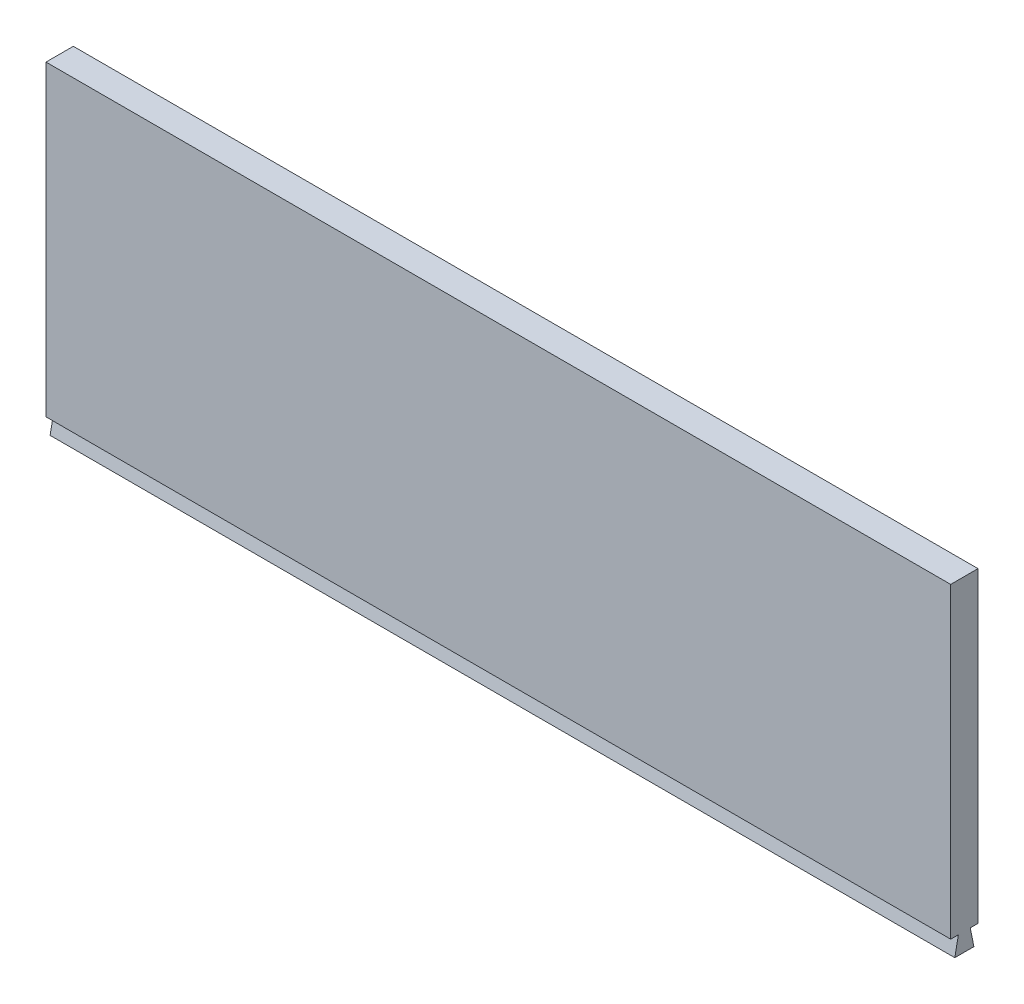
ISO-10303-21;
HEADER;
FILE_DESCRIPTION(('STEP AP214'),'2;1');
FILE_NAME('part.step','',(''),(''),'','','');
FILE_SCHEMA(('AUTOMOTIVE_DESIGN { 1 0 10303 214 1 1 1 1 }'));
ENDSEC;
DATA;
#1=APPLICATION_CONTEXT('core data for automotive mechanical design processes');
#2=APPLICATION_PROTOCOL_DEFINITION('international standard','automotive_design',2000,#1);
#3=PRODUCT_CONTEXT('',#1,'mechanical');
#4=PRODUCT('Part','Part','',(#3));
#5=PRODUCT_RELATED_PRODUCT_CATEGORY('part','',(#4));
#6=PRODUCT_DEFINITION_FORMATION('','',#4);
#7=PRODUCT_DEFINITION_CONTEXT('part definition',#1,'design');
#8=PRODUCT_DEFINITION('design','',#6,#7);
#9=PRODUCT_DEFINITION_SHAPE('','',#8);
#10=(LENGTH_UNIT() NAMED_UNIT(*) SI_UNIT(.MILLI.,.METRE.));
#11=(NAMED_UNIT(*) PLANE_ANGLE_UNIT() SI_UNIT($,.RADIAN.));
#12=(NAMED_UNIT(*) SI_UNIT($,.STERADIAN.) SOLID_ANGLE_UNIT());
#13=UNCERTAINTY_MEASURE_WITH_UNIT(LENGTH_MEASURE(1.E-05),#10,'distance_accuracy_value','');
#14=(GEOMETRIC_REPRESENTATION_CONTEXT(3) GLOBAL_UNCERTAINTY_ASSIGNED_CONTEXT((#13)) GLOBAL_UNIT_ASSIGNED_CONTEXT((#10,
#11,#12)) REPRESENTATION_CONTEXT('',''));
#15=CARTESIAN_POINT('',(0.,0.,0.));
#16=DIRECTION('',(0.,0.,1.));
#17=DIRECTION('',(1.,0.,0.));
#18=AXIS2_PLACEMENT_3D('',#15,#16,#17);
#19=CARTESIAN_POINT('',(0.,0.,8.));
#20=DIRECTION('',(0.,1.,0.));
#21=DIRECTION('',(0.,0.,1.));
#22=AXIS2_PLACEMENT_3D('',#19,#20,#21);
#23=PLANE('',#22);
#24=DIRECTION('',(-1.,0.,0.));
#25=VECTOR('',#24,1.);
#26=CARTESIAN_POINT('',(265.,0.,5.74));
#27=LINE('',#26,#25);
#28=CARTESIAN_POINT('',(265.,0.,5.74));
#29=VERTEX_POINT('',#28);
#30=CARTESIAN_POINT('',(0.,0.,5.74));
#31=VERTEX_POINT('',#30);
#32=EDGE_CURVE('E145',#29,#31,#27,.T.);
#33=ORIENTED_EDGE('',*,*,#32,.F.);
#34=DIRECTION('',(0.,0.,-1.));
#35=VECTOR('',#34,1.);
#36=CARTESIAN_POINT('',(265.,0.,8.));
#37=LINE('',#36,#35);
#38=CARTESIAN_POINT('',(265.,0.,8.));
#39=VERTEX_POINT('',#38);
#40=EDGE_CURVE('E130',#39,#29,#37,.T.);
#41=ORIENTED_EDGE('',*,*,#40,.F.);
#42=DIRECTION('',(1.,0.,0.));
#43=VECTOR('',#42,1.);
#44=CARTESIAN_POINT('',(0.,0.,8.));
#45=LINE('',#44,#43);
#46=CARTESIAN_POINT('',(0.,0.,8.));
#47=VERTEX_POINT('',#46);
#48=EDGE_CURVE('E86',#47,#39,#45,.T.);
#49=ORIENTED_EDGE('',*,*,#48,.F.);
#50=DIRECTION('',(0.,0.,-1.));
#51=VECTOR('',#50,1.);
#52=CARTESIAN_POINT('',(0.,0.,8.));
#53=LINE('',#52,#51);
#54=EDGE_CURVE('E11',#47,#31,#53,.T.);
#55=ORIENTED_EDGE('',*,*,#54,.T.);
#56=EDGE_LOOP('',(#33,#41,#49,#55));
#57=FACE_BOUND('',#56,.T.);
#58=ADVANCED_FACE('F34',(#57),#23,.F.);
#59=CARTESIAN_POINT('',(0.,0.,8.));
#60=DIRECTION('',(1.,0.,0.));
#61=DIRECTION('',(0.,0.,-1.));
#62=AXIS2_PLACEMENT_3D('',#59,#60,#61);
#63=PLANE('',#62);
#64=DIRECTION('',(0.,-1.,0.));
#65=VECTOR('',#64,1.);
#66=CARTESIAN_POINT('',(0.,0.,0.));
#67=LINE('',#66,#65);
#68=CARTESIAN_POINT('',(0.,90.,0.));
#69=VERTEX_POINT('',#68);
#70=CARTESIAN_POINT('',(0.,0.,0.));
#71=VERTEX_POINT('',#70);
#72=EDGE_CURVE('E142',#69,#71,#67,.T.);
#73=ORIENTED_EDGE('',*,*,#72,.T.);
#74=CARTESIAN_POINT('',(0.,0.,2.26));
#75=VERTEX_POINT('',#74);
#76=EDGE_CURVE('E42',#75,#71,#53,.T.);
#77=ORIENTED_EDGE('',*,*,#76,.F.);
#78=DIRECTION('',(0.,-0.98058067569092,-0.196116135138184));
#79=VECTOR('',#78,1.);
#80=CARTESIAN_POINT('',(0.,0.,2.26));
#81=LINE('',#80,#79);
#82=CARTESIAN_POINT('',(0.,-5.3,1.2));
#83=VERTEX_POINT('',#82);
#84=EDGE_CURVE('E49',#75,#83,#81,.T.);
#85=ORIENTED_EDGE('',*,*,#84,.T.);
#86=DIRECTION('',(0.,0.,1.));
#87=VECTOR('',#86,1.);
#88=CARTESIAN_POINT('',(0.,-5.3,1.2));
#89=LINE('',#88,#87);
#90=CARTESIAN_POINT('',(0.,-5.3,6.8));
#91=VERTEX_POINT('',#90);
#92=EDGE_CURVE('E157',#83,#91,#89,.T.);
#93=ORIENTED_EDGE('',*,*,#92,.T.);
#94=DIRECTION('',(0.,0.98058067569092,-0.196116135138184));
#95=VECTOR('',#94,1.);
#96=CARTESIAN_POINT('',(0.,-5.3,6.8));
#97=LINE('',#96,#95);
#98=EDGE_CURVE('E124',#91,#31,#97,.T.);
#99=ORIENTED_EDGE('',*,*,#98,.T.);
#100=ORIENTED_EDGE('',*,*,#54,.F.);
#101=DIRECTION('',(0.,-1.,0.));
#102=VECTOR('',#101,1.);
#103=CARTESIAN_POINT('',(0.,0.,8.));
#104=LINE('',#103,#102);
#105=CARTESIAN_POINT('',(0.,90.,8.));
#106=VERTEX_POINT('',#105);
#107=EDGE_CURVE('E138',#106,#47,#104,.T.);
#108=ORIENTED_EDGE('',*,*,#107,.F.);
#109=DIRECTION('',(0.,0.,-1.));
#110=VECTOR('',#109,1.);
#111=CARTESIAN_POINT('',(0.,90.,8.));
#112=LINE('',#111,#110);
#113=EDGE_CURVE('E133',#106,#69,#112,.T.);
#114=ORIENTED_EDGE('',*,*,#113,.T.);
#115=EDGE_LOOP('',(#73,#77,#85,#93,#99,#100,#108,#114));
#116=FACE_BOUND('',#115,.T.);
#117=ADVANCED_FACE('F36',(#116),#63,.F.);
#118=CARTESIAN_POINT('',(265.,0.,2.26));
#119=VERTEX_POINT('',#118);
#120=CARTESIAN_POINT('',(265.,0.,0.));
#121=VERTEX_POINT('',#120);
#122=EDGE_CURVE('E119',#119,#121,#37,.T.);
#123=ORIENTED_EDGE('',*,*,#122,.F.);
#124=DIRECTION('',(-1.,0.,0.));
#125=VECTOR('',#124,1.);
#126=CARTESIAN_POINT('',(265.,0.,2.26));
#127=LINE('',#126,#125);
#128=EDGE_CURVE('E106',#119,#75,#127,.T.);
#129=ORIENTED_EDGE('',*,*,#128,.T.);
#130=ORIENTED_EDGE('',*,*,#76,.T.);
#131=DIRECTION('',(1.,0.,0.));
#132=VECTOR('',#131,1.);
#133=CARTESIAN_POINT('',(0.,0.,0.));
#134=LINE('',#133,#132);
#135=EDGE_CURVE('E128',#71,#121,#134,.T.);
#136=ORIENTED_EDGE('',*,*,#135,.T.);
#137=EDGE_LOOP('',(#123,#129,#130,#136));
#138=FACE_BOUND('',#137,.T.);
#139=ADVANCED_FACE('F126',(#138),#23,.F.);
#140=CARTESIAN_POINT('',(265.,0.,8.));
#141=DIRECTION('',(-1.,0.,0.));
#142=DIRECTION('',(0.,0.,1.));
#143=AXIS2_PLACEMENT_3D('',#140,#141,#142);
#144=PLANE('',#143);
#145=DIRECTION('',(0.,1.,0.));
#146=VECTOR('',#145,1.);
#147=CARTESIAN_POINT('',(265.,0.,0.));
#148=LINE('',#147,#146);
#149=CARTESIAN_POINT('',(265.,90.,0.));
#150=VERTEX_POINT('',#149);
#151=EDGE_CURVE('E139',#121,#150,#148,.T.);
#152=ORIENTED_EDGE('',*,*,#151,.T.);
#153=DIRECTION('',(0.,0.,-1.));
#154=VECTOR('',#153,1.);
#155=CARTESIAN_POINT('',(265.,90.,8.));
#156=LINE('',#155,#154);
#157=CARTESIAN_POINT('',(265.,90.,8.));
#158=VERTEX_POINT('',#157);
#159=EDGE_CURVE('E131',#158,#150,#156,.T.);
#160=ORIENTED_EDGE('',*,*,#159,.F.);
#161=DIRECTION('',(0.,1.,0.));
#162=VECTOR('',#161,1.);
#163=CARTESIAN_POINT('',(265.,0.,8.));
#164=LINE('',#163,#162);
#165=EDGE_CURVE('E147',#39,#158,#164,.T.);
#166=ORIENTED_EDGE('',*,*,#165,.F.);
#167=ORIENTED_EDGE('',*,*,#40,.T.);
#168=DIRECTION('',(0.,0.98058067569092,-0.196116135138184));
#169=VECTOR('',#168,1.);
#170=CARTESIAN_POINT('',(265.,-5.3,6.8));
#171=LINE('',#170,#169);
#172=CARTESIAN_POINT('',(265.,-5.3,6.8));
#173=VERTEX_POINT('',#172);
#174=EDGE_CURVE('E114',#173,#29,#171,.T.);
#175=ORIENTED_EDGE('',*,*,#174,.F.);
#176=DIRECTION('',(0.,0.,1.));
#177=VECTOR('',#176,1.);
#178=CARTESIAN_POINT('',(265.,-5.3,1.2));
#179=LINE('',#178,#177);
#180=CARTESIAN_POINT('',(265.,-5.3,1.2));
#181=VERTEX_POINT('',#180);
#182=EDGE_CURVE('E123',#181,#173,#179,.T.);
#183=ORIENTED_EDGE('',*,*,#182,.F.);
#184=DIRECTION('',(0.,-0.98058067569092,-0.196116135138184));
#185=VECTOR('',#184,1.);
#186=CARTESIAN_POINT('',(265.,0.,2.26));
#187=LINE('',#186,#185);
#188=EDGE_CURVE('E109',#119,#181,#187,.T.);
#189=ORIENTED_EDGE('',*,*,#188,.F.);
#190=ORIENTED_EDGE('',*,*,#122,.T.);
#191=EDGE_LOOP('',(#152,#160,#166,#167,#175,#183,#189,#190));
#192=FACE_BOUND('',#191,.T.);
#193=ADVANCED_FACE('F118',(#192),#144,.F.);
#194=CARTESIAN_POINT('',(0.,90.,8.));
#195=DIRECTION('',(0.,-1.,0.));
#196=DIRECTION('',(0.,0.,-1.));
#197=AXIS2_PLACEMENT_3D('',#194,#195,#196);
#198=PLANE('',#197);
#199=DIRECTION('',(-1.,0.,0.));
#200=VECTOR('',#199,1.);
#201=CARTESIAN_POINT('',(0.,90.,0.));
#202=LINE('',#201,#200);
#203=EDGE_CURVE('E79',#150,#69,#202,.T.);
#204=ORIENTED_EDGE('',*,*,#203,.T.);
#205=ORIENTED_EDGE('',*,*,#113,.F.);
#206=DIRECTION('',(-1.,0.,0.));
#207=VECTOR('',#206,1.);
#208=CARTESIAN_POINT('',(0.,90.,8.));
#209=LINE('',#208,#207);
#210=EDGE_CURVE('E58',#158,#106,#209,.T.);
#211=ORIENTED_EDGE('',*,*,#210,.F.);
#212=ORIENTED_EDGE('',*,*,#159,.T.);
#213=EDGE_LOOP('',(#204,#205,#211,#212));
#214=FACE_BOUND('',#213,.T.);
#215=ADVANCED_FACE('F177',(#214),#198,.F.);
#216=CARTESIAN_POINT('',(0.,0.,8.));
#217=DIRECTION('',(0.,0.,-1.));
#218=DIRECTION('',(-1.,0.,0.));
#219=AXIS2_PLACEMENT_3D('',#216,#217,#218);
#220=PLANE('',#219);
#221=ORIENTED_EDGE('',*,*,#107,.T.);
#222=ORIENTED_EDGE('',*,*,#48,.T.);
#223=ORIENTED_EDGE('',*,*,#165,.T.);
#224=ORIENTED_EDGE('',*,*,#210,.T.);
#225=EDGE_LOOP('',(#221,#222,#223,#224));
#226=FACE_BOUND('',#225,.T.);
#227=ADVANCED_FACE('F179',(#226),#220,.F.);
#228=CARTESIAN_POINT('',(0.,0.,0.));
#229=DIRECTION('',(0.,0.,-1.));
#230=DIRECTION('',(-1.,0.,0.));
#231=AXIS2_PLACEMENT_3D('',#228,#229,#230);
#232=PLANE('',#231);
#233=ORIENTED_EDGE('',*,*,#72,.F.);
#234=ORIENTED_EDGE('',*,*,#203,.F.);
#235=ORIENTED_EDGE('',*,*,#151,.F.);
#236=ORIENTED_EDGE('',*,*,#135,.F.);
#237=EDGE_LOOP('',(#233,#234,#235,#236));
#238=FACE_BOUND('',#237,.T.);
#239=ADVANCED_FACE('F175',(#238),#232,.T.);
#240=CARTESIAN_POINT('',(265.,-5.3,6.8));
#241=DIRECTION('',(0.,0.196116135138184,0.98058067569092));
#242=DIRECTION('',(0.,-0.98058067569092,0.196116135138184));
#243=AXIS2_PLACEMENT_3D('',#240,#241,#242);
#244=PLANE('',#243);
#245=ORIENTED_EDGE('',*,*,#98,.F.);
#246=DIRECTION('',(-1.,0.,0.));
#247=VECTOR('',#246,1.);
#248=CARTESIAN_POINT('',(265.,-5.3,6.8));
#249=LINE('',#248,#247);
#250=EDGE_CURVE('E152',#173,#91,#249,.T.);
#251=ORIENTED_EDGE('',*,*,#250,.F.);
#252=ORIENTED_EDGE('',*,*,#174,.T.);
#253=ORIENTED_EDGE('',*,*,#32,.T.);
#254=EDGE_LOOP('',(#245,#251,#252,#253));
#255=FACE_BOUND('',#254,.T.);
#256=ADVANCED_FACE('F169',(#255),#244,.T.);
#257=CARTESIAN_POINT('',(265.,-5.3,1.2));
#258=DIRECTION('',(0.,-1.,0.));
#259=DIRECTION('',(0.,0.,-1.));
#260=AXIS2_PLACEMENT_3D('',#257,#258,#259);
#261=PLANE('',#260);
#262=ORIENTED_EDGE('',*,*,#92,.F.);
#263=DIRECTION('',(-1.,0.,0.));
#264=VECTOR('',#263,1.);
#265=CARTESIAN_POINT('',(265.,-5.3,1.2));
#266=LINE('',#265,#264);
#267=EDGE_CURVE('E113',#181,#83,#266,.T.);
#268=ORIENTED_EDGE('',*,*,#267,.F.);
#269=ORIENTED_EDGE('',*,*,#182,.T.);
#270=ORIENTED_EDGE('',*,*,#250,.T.);
#271=EDGE_LOOP('',(#262,#268,#269,#270));
#272=FACE_BOUND('',#271,.T.);
#273=ADVANCED_FACE('F164',(#272),#261,.T.);
#274=CARTESIAN_POINT('',(265.,0.,2.26));
#275=DIRECTION('',(0.,0.196116135138184,-0.98058067569092));
#276=DIRECTION('',(0.,0.98058067569092,0.196116135138184));
#277=AXIS2_PLACEMENT_3D('',#274,#275,#276);
#278=PLANE('',#277);
#279=ORIENTED_EDGE('',*,*,#84,.F.);
#280=ORIENTED_EDGE('',*,*,#128,.F.);
#281=ORIENTED_EDGE('',*,*,#188,.T.);
#282=ORIENTED_EDGE('',*,*,#267,.T.);
#283=EDGE_LOOP('',(#279,#280,#281,#282));
#284=FACE_BOUND('',#283,.T.);
#285=ADVANCED_FACE('F108',(#284),#278,.T.);
#286=CLOSED_SHELL('',(#58,#117,#139,#193,#215,#227,#239,#256,#273,#285));
#287=MANIFOLD_SOLID_BREP('B2',#286);
#288=ADVANCED_BREP_SHAPE_REPRESENTATION('',(#18,#287),#14);
#289=SHAPE_DEFINITION_REPRESENTATION(#9,#288);
ENDSEC;
END-ISO-10303-21;
